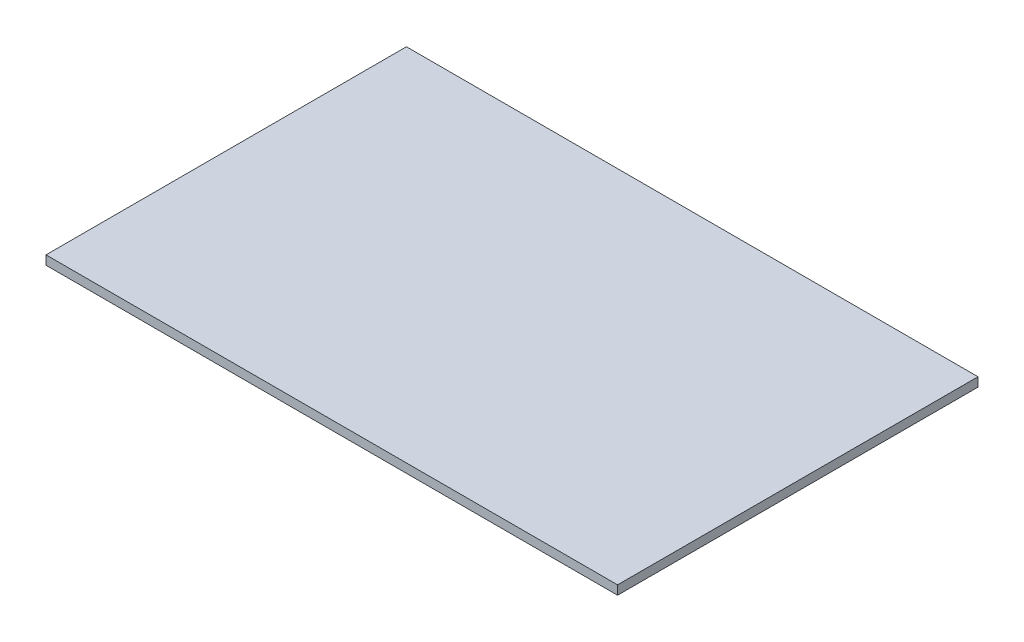
ISO-10303-21;
HEADER;
FILE_DESCRIPTION(('STEP AP214'),'2;1');
FILE_NAME('part.step','',(''),(''),'','','');
FILE_SCHEMA(('AUTOMOTIVE_DESIGN { 1 0 10303 214 1 1 1 1 }'));
ENDSEC;
DATA;
#1=APPLICATION_CONTEXT('core data for automotive mechanical design processes');
#2=APPLICATION_PROTOCOL_DEFINITION('international standard','automotive_design',2000,#1);
#3=PRODUCT_CONTEXT('',#1,'mechanical');
#4=PRODUCT('Part','Part','',(#3));
#5=PRODUCT_RELATED_PRODUCT_CATEGORY('part','',(#4));
#6=PRODUCT_DEFINITION_FORMATION('','',#4);
#7=PRODUCT_DEFINITION_CONTEXT('part definition',#1,'design');
#8=PRODUCT_DEFINITION('design','',#6,#7);
#9=PRODUCT_DEFINITION_SHAPE('','',#8);
#10=(LENGTH_UNIT() NAMED_UNIT(*) SI_UNIT(.MILLI.,.METRE.));
#11=(NAMED_UNIT(*) PLANE_ANGLE_UNIT() SI_UNIT($,.RADIAN.));
#12=(NAMED_UNIT(*) SI_UNIT($,.STERADIAN.) SOLID_ANGLE_UNIT());
#13=UNCERTAINTY_MEASURE_WITH_UNIT(LENGTH_MEASURE(1.E-05),#10,'distance_accuracy_value','');
#14=(GEOMETRIC_REPRESENTATION_CONTEXT(3) GLOBAL_UNCERTAINTY_ASSIGNED_CONTEXT((#13)) GLOBAL_UNIT_ASSIGNED_CONTEXT((#10,
#11,#12)) REPRESENTATION_CONTEXT('',''));
#15=CARTESIAN_POINT('',(0.,0.,0.));
#16=DIRECTION('',(0.,0.,1.));
#17=DIRECTION('',(1.,0.,0.));
#18=AXIS2_PLACEMENT_3D('',#15,#16,#17);
#19=CARTESIAN_POINT('',(-42.8,1.35,26.99));
#20=DIRECTION('',(1.,0.,0.));
#21=DIRECTION('',(0.,0.,-1.));
#22=AXIS2_PLACEMENT_3D('',#19,#20,#21);
#23=PLANE('',#22);
#24=DIRECTION('',(0.,0.,1.));
#25=VECTOR('',#24,1.);
#26=CARTESIAN_POINT('',(-42.8,0.,26.99));
#27=LINE('',#26,#25);
#28=CARTESIAN_POINT('',(-42.8,0.,-26.99));
#29=VERTEX_POINT('',#28);
#30=CARTESIAN_POINT('',(-42.8,0.,26.99));
#31=VERTEX_POINT('',#30);
#32=EDGE_CURVE('E97',#29,#31,#27,.T.);
#33=ORIENTED_EDGE('',*,*,#32,.T.);
#34=DIRECTION('',(0.,-1.,0.));
#35=VECTOR('',#34,1.);
#36=CARTESIAN_POINT('',(-42.8,1.35,26.99));
#37=LINE('',#36,#35);
#38=CARTESIAN_POINT('',(-42.8,1.35,26.99));
#39=VERTEX_POINT('',#38);
#40=EDGE_CURVE('E11',#39,#31,#37,.T.);
#41=ORIENTED_EDGE('',*,*,#40,.F.);
#42=DIRECTION('',(0.,0.,1.));
#43=VECTOR('',#42,1.);
#44=CARTESIAN_POINT('',(-42.8,1.35,26.99));
#45=LINE('',#44,#43);
#46=CARTESIAN_POINT('',(-42.8,1.35,-26.99));
#47=VERTEX_POINT('',#46);
#48=EDGE_CURVE('E85',#47,#39,#45,.T.);
#49=ORIENTED_EDGE('',*,*,#48,.F.);
#50=DIRECTION('',(0.,-1.,0.));
#51=VECTOR('',#50,1.);
#52=CARTESIAN_POINT('',(-42.8,1.35,-26.99));
#53=LINE('',#52,#51);
#54=EDGE_CURVE('E93',#47,#29,#53,.T.);
#55=ORIENTED_EDGE('',*,*,#54,.T.);
#56=EDGE_LOOP('',(#33,#41,#49,#55));
#57=FACE_BOUND('',#56,.T.);
#58=ADVANCED_FACE('F34',(#57),#23,.F.);
#59=CARTESIAN_POINT('',(42.8,1.35,26.99));
#60=DIRECTION('',(0.,0.,-1.));
#61=DIRECTION('',(-1.,0.,0.));
#62=AXIS2_PLACEMENT_3D('',#59,#60,#61);
#63=PLANE('',#62);
#64=DIRECTION('',(1.,0.,0.));
#65=VECTOR('',#64,1.);
#66=CARTESIAN_POINT('',(42.8,0.,26.99));
#67=LINE('',#66,#65);
#68=CARTESIAN_POINT('',(42.8,0.,26.99));
#69=VERTEX_POINT('',#68);
#70=EDGE_CURVE('E89',#31,#69,#67,.T.);
#71=ORIENTED_EDGE('',*,*,#70,.T.);
#72=DIRECTION('',(0.,-1.,0.));
#73=VECTOR('',#72,1.);
#74=CARTESIAN_POINT('',(42.8,1.35,26.99));
#75=LINE('',#74,#73);
#76=CARTESIAN_POINT('',(42.8,1.35,26.99));
#77=VERTEX_POINT('',#76);
#78=EDGE_CURVE('E42',#77,#69,#75,.T.);
#79=ORIENTED_EDGE('',*,*,#78,.F.);
#80=DIRECTION('',(1.,0.,0.));
#81=VECTOR('',#80,1.);
#82=CARTESIAN_POINT('',(42.8,1.35,26.99));
#83=LINE('',#82,#81);
#84=EDGE_CURVE('E80',#39,#77,#83,.T.);
#85=ORIENTED_EDGE('',*,*,#84,.F.);
#86=ORIENTED_EDGE('',*,*,#40,.T.);
#87=EDGE_LOOP('',(#71,#79,#85,#86));
#88=FACE_BOUND('',#87,.T.);
#89=ADVANCED_FACE('F88',(#88),#63,.F.);
#90=CARTESIAN_POINT('',(42.8,1.35,26.99));
#91=DIRECTION('',(-1.,0.,0.));
#92=DIRECTION('',(0.,0.,1.));
#93=AXIS2_PLACEMENT_3D('',#90,#91,#92);
#94=PLANE('',#93);
#95=DIRECTION('',(0.,0.,-1.));
#96=VECTOR('',#95,1.);
#97=CARTESIAN_POINT('',(42.8,0.,26.99));
#98=LINE('',#97,#96);
#99=CARTESIAN_POINT('',(42.8,0.,-26.99));
#100=VERTEX_POINT('',#99);
#101=EDGE_CURVE('E67',#69,#100,#98,.T.);
#102=ORIENTED_EDGE('',*,*,#101,.T.);
#103=DIRECTION('',(0.,-1.,0.));
#104=VECTOR('',#103,1.);
#105=CARTESIAN_POINT('',(42.8,1.35,-26.99));
#106=LINE('',#105,#104);
#107=CARTESIAN_POINT('',(42.8,1.35,-26.99));
#108=VERTEX_POINT('',#107);
#109=EDGE_CURVE('E90',#108,#100,#106,.T.);
#110=ORIENTED_EDGE('',*,*,#109,.F.);
#111=DIRECTION('',(0.,0.,-1.));
#112=VECTOR('',#111,1.);
#113=CARTESIAN_POINT('',(42.8,1.35,26.99));
#114=LINE('',#113,#112);
#115=EDGE_CURVE('E83',#77,#108,#114,.T.);
#116=ORIENTED_EDGE('',*,*,#115,.F.);
#117=ORIENTED_EDGE('',*,*,#78,.T.);
#118=EDGE_LOOP('',(#102,#110,#116,#117));
#119=FACE_BOUND('',#118,.T.);
#120=ADVANCED_FACE('F91',(#119),#94,.F.);
#121=CARTESIAN_POINT('',(42.8,1.35,-26.99));
#122=DIRECTION('',(0.,0.,1.));
#123=DIRECTION('',(1.,0.,0.));
#124=AXIS2_PLACEMENT_3D('',#121,#122,#123);
#125=PLANE('',#124);
#126=DIRECTION('',(-1.,0.,0.));
#127=VECTOR('',#126,1.);
#128=CARTESIAN_POINT('',(42.8,0.,-26.99));
#129=LINE('',#128,#127);
#130=EDGE_CURVE('E73',#100,#29,#129,.T.);
#131=ORIENTED_EDGE('',*,*,#130,.T.);
#132=ORIENTED_EDGE('',*,*,#54,.F.);
#133=DIRECTION('',(-1.,0.,0.));
#134=VECTOR('',#133,1.);
#135=CARTESIAN_POINT('',(42.8,1.35,-26.99));
#136=LINE('',#135,#134);
#137=EDGE_CURVE('E50',#108,#47,#136,.T.);
#138=ORIENTED_EDGE('',*,*,#137,.F.);
#139=ORIENTED_EDGE('',*,*,#109,.T.);
#140=EDGE_LOOP('',(#131,#132,#138,#139));
#141=FACE_BOUND('',#140,.T.);
#142=ADVANCED_FACE('F104',(#141),#125,.F.);
#143=CARTESIAN_POINT('',(-42.8,1.35,-26.99));
#144=DIRECTION('',(0.,1.,0.));
#145=DIRECTION('',(0.,0.,1.));
#146=AXIS2_PLACEMENT_3D('',#143,#144,#145);
#147=PLANE('',#146);
#148=ORIENTED_EDGE('',*,*,#48,.T.);
#149=ORIENTED_EDGE('',*,*,#84,.T.);
#150=ORIENTED_EDGE('',*,*,#115,.T.);
#151=ORIENTED_EDGE('',*,*,#137,.T.);
#152=EDGE_LOOP('',(#148,#149,#150,#151));
#153=FACE_BOUND('',#152,.T.);
#154=ADVANCED_FACE('F81',(#153),#147,.T.);
#155=CARTESIAN_POINT('',(-42.8,0.,-26.99));
#156=DIRECTION('',(0.,1.,0.));
#157=DIRECTION('',(0.,0.,1.));
#158=AXIS2_PLACEMENT_3D('',#155,#156,#157);
#159=PLANE('',#158);
#160=ORIENTED_EDGE('',*,*,#32,.F.);
#161=ORIENTED_EDGE('',*,*,#130,.F.);
#162=ORIENTED_EDGE('',*,*,#101,.F.);
#163=ORIENTED_EDGE('',*,*,#70,.F.);
#164=EDGE_LOOP('',(#160,#161,#162,#163));
#165=FACE_BOUND('',#164,.T.);
#166=ADVANCED_FACE('F107',(#165),#159,.F.);
#167=CLOSED_SHELL('',(#58,#89,#120,#142,#154,#166));
#168=MANIFOLD_SOLID_BREP('B2',#167);
#169=ADVANCED_BREP_SHAPE_REPRESENTATION('',(#18,#168),#14);
#170=SHAPE_DEFINITION_REPRESENTATION(#9,#169);
ENDSEC;
END-ISO-10303-21;
